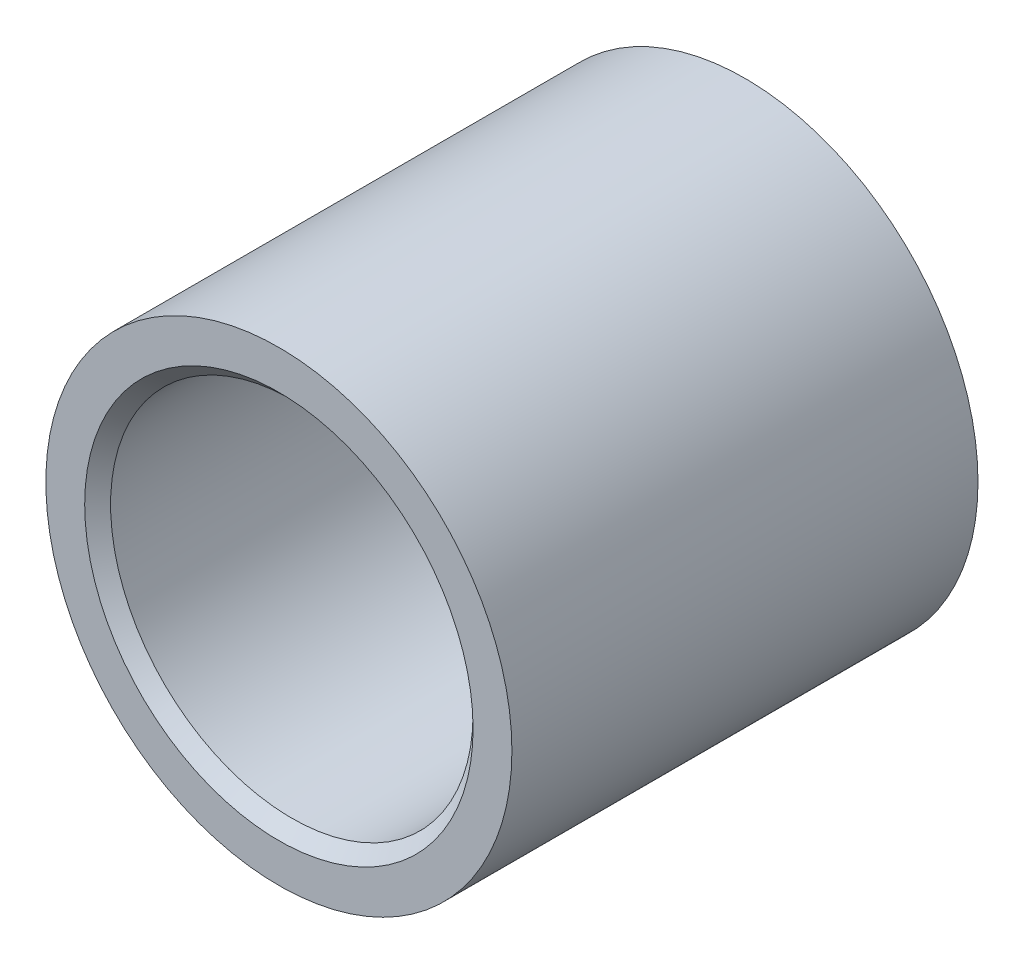
ISO-10303-21;
HEADER;
FILE_DESCRIPTION(('STEP AP214'),'2;1');
FILE_NAME('part.step','',(''),(''),'','','');
FILE_SCHEMA(('AUTOMOTIVE_DESIGN { 1 0 10303 214 1 1 1 1 }'));
ENDSEC;
DATA;
#1=APPLICATION_CONTEXT('core data for automotive mechanical design processes');
#2=APPLICATION_PROTOCOL_DEFINITION('international standard','automotive_design',2000,#1);
#3=PRODUCT_CONTEXT('',#1,'mechanical');
#4=PRODUCT('Part','Part','',(#3));
#5=PRODUCT_RELATED_PRODUCT_CATEGORY('part','',(#4));
#6=PRODUCT_DEFINITION_FORMATION('','',#4);
#7=PRODUCT_DEFINITION_CONTEXT('part definition',#1,'design');
#8=PRODUCT_DEFINITION('design','',#6,#7);
#9=PRODUCT_DEFINITION_SHAPE('','',#8);
#10=(LENGTH_UNIT() NAMED_UNIT(*) SI_UNIT(.MILLI.,.METRE.));
#11=(NAMED_UNIT(*) PLANE_ANGLE_UNIT() SI_UNIT($,.RADIAN.));
#12=(NAMED_UNIT(*) SI_UNIT($,.STERADIAN.) SOLID_ANGLE_UNIT());
#13=UNCERTAINTY_MEASURE_WITH_UNIT(LENGTH_MEASURE(1.E-05),#10,'distance_accuracy_value','');
#14=(GEOMETRIC_REPRESENTATION_CONTEXT(3) GLOBAL_UNCERTAINTY_ASSIGNED_CONTEXT((#13)) GLOBAL_UNIT_ASSIGNED_CONTEXT((#10,
#11,#12)) REPRESENTATION_CONTEXT('',''));
#15=CARTESIAN_POINT('',(0.,0.,0.));
#16=DIRECTION('',(0.,0.,1.));
#17=DIRECTION('',(1.,0.,0.));
#18=AXIS2_PLACEMENT_3D('',#15,#16,#17);
#19=CARTESIAN_POINT('',(0.,0.,18.));
#20=DIRECTION('',(0.,0.,1.));
#21=DIRECTION('',(1.,0.,0.));
#22=AXIS2_PLACEMENT_3D('',#19,#20,#21);
#23=PLANE('',#22);
#24=CARTESIAN_POINT('',(0.,0.,18.));
#25=DIRECTION('',(0.,0.,1.));
#26=DIRECTION('',(1.,0.,0.));
#27=AXIS2_PLACEMENT_3D('',#24,#25,#26);
#28=CIRCLE('',#27,15.);
#29=CARTESIAN_POINT('',(15.,0.,18.));
#30=VERTEX_POINT('',#29);
#31=EDGE_CURVE('E10',#30,#30,#28,.F.);
#32=ORIENTED_EDGE('',*,*,#31,.T.);
#33=EDGE_LOOP('',(#32));
#34=FACE_BOUND('',#33,.T.);
#35=CARTESIAN_POINT('',(0.,0.,18.));
#36=DIRECTION('',(0.,0.,1.));
#37=DIRECTION('',(1.,0.,0.));
#38=AXIS2_PLACEMENT_3D('',#35,#36,#37);
#39=CIRCLE('',#38,18.);
#40=CARTESIAN_POINT('',(18.,0.,18.));
#41=VERTEX_POINT('',#40);
#42=EDGE_CURVE('E66',#41,#41,#39,.T.);
#43=ORIENTED_EDGE('',*,*,#42,.T.);
#44=EDGE_LOOP('',(#43));
#45=FACE_BOUND('',#44,.T.);
#46=ADVANCED_FACE('F45',(#34,#45),#23,.T.);
#47=CARTESIAN_POINT('',(0.,0.,-18.));
#48=DIRECTION('',(0.,0.,1.));
#49=DIRECTION('',(1.,0.,0.));
#50=AXIS2_PLACEMENT_3D('',#47,#48,#49);
#51=PLANE('',#50);
#52=CARTESIAN_POINT('',(0.,0.,-18.));
#53=DIRECTION('',(0.,0.,1.));
#54=DIRECTION('',(1.,0.,0.));
#55=AXIS2_PLACEMENT_3D('',#52,#53,#54);
#56=CIRCLE('',#55,15.);
#57=CARTESIAN_POINT('',(15.,0.,-18.));
#58=VERTEX_POINT('',#57);
#59=EDGE_CURVE('E61',#58,#58,#56,.T.);
#60=ORIENTED_EDGE('',*,*,#59,.T.);
#61=EDGE_LOOP('',(#60));
#62=FACE_BOUND('',#61,.T.);
#63=CARTESIAN_POINT('',(0.,0.,-18.));
#64=DIRECTION('',(0.,0.,1.));
#65=DIRECTION('',(1.,0.,0.));
#66=AXIS2_PLACEMENT_3D('',#63,#64,#65);
#67=CIRCLE('',#66,18.);
#68=CARTESIAN_POINT('',(18.,0.,-18.));
#69=VERTEX_POINT('',#68);
#70=EDGE_CURVE('E67',#69,#69,#67,.T.);
#71=ORIENTED_EDGE('',*,*,#70,.F.);
#72=EDGE_LOOP('',(#71));
#73=FACE_BOUND('',#72,.T.);
#74=ADVANCED_FACE('F78',(#62,#73),#51,.F.);
#75=CARTESIAN_POINT('',(0.,0.,18.));
#76=DIRECTION('',(0.,0.,-1.));
#77=DIRECTION('',(-1.,0.,0.));
#78=AXIS2_PLACEMENT_3D('',#75,#76,#77);
#79=CYLINDRICAL_SURFACE('',#78,18.);
#80=ORIENTED_EDGE('',*,*,#42,.F.);
#81=EDGE_LOOP('',(#80));
#82=FACE_BOUND('',#81,.T.);
#83=ORIENTED_EDGE('',*,*,#70,.T.);
#84=EDGE_LOOP('',(#83));
#85=FACE_BOUND('',#84,.T.);
#86=ADVANCED_FACE('F74',(#82,#85),#79,.T.);
#87=CARTESIAN_POINT('',(0.,0.,18.));
#88=DIRECTION('',(0.,0.,-1.));
#89=DIRECTION('',(-1.,0.,0.));
#90=AXIS2_PLACEMENT_3D('',#87,#88,#89);
#91=CYLINDRICAL_SURFACE('',#90,14.);
#92=CARTESIAN_POINT('',(0.,0.,-17.));
#93=DIRECTION('',(0.,0.,1.));
#94=DIRECTION('',(1.,0.,0.));
#95=AXIS2_PLACEMENT_3D('',#92,#93,#94);
#96=CIRCLE('',#95,14.);
#97=CARTESIAN_POINT('',(14.,0.,-17.));
#98=VERTEX_POINT('',#97);
#99=EDGE_CURVE('E53',#98,#98,#96,.F.);
#100=ORIENTED_EDGE('',*,*,#99,.T.);
#101=EDGE_LOOP('',(#100));
#102=FACE_BOUND('',#101,.T.);
#103=CARTESIAN_POINT('',(0.,0.,17.));
#104=DIRECTION('',(0.,0.,1.));
#105=DIRECTION('',(1.,0.,0.));
#106=AXIS2_PLACEMENT_3D('',#103,#104,#105);
#107=CIRCLE('',#106,14.);
#108=CARTESIAN_POINT('',(14.,0.,17.));
#109=VERTEX_POINT('',#108);
#110=EDGE_CURVE('E57',#109,#109,#107,.T.);
#111=ORIENTED_EDGE('',*,*,#110,.T.);
#112=EDGE_LOOP('',(#111));
#113=FACE_BOUND('',#112,.T.);
#114=ADVANCED_FACE('F77',(#102,#113),#91,.F.);
#115=CARTESIAN_POINT('',(0.,0.,-18.));
#116=DIRECTION('',(0.,0.,-1.));
#117=DIRECTION('',(-1.,0.,0.));
#118=AXIS2_PLACEMENT_3D('',#115,#116,#117);
#119=CONICAL_SURFACE('',#118,15.,0.785398163397442);
#120=ORIENTED_EDGE('',*,*,#99,.F.);
#121=EDGE_LOOP('',(#120));
#122=FACE_BOUND('',#121,.T.);
#123=ORIENTED_EDGE('',*,*,#59,.F.);
#124=EDGE_LOOP('',(#123));
#125=FACE_BOUND('',#124,.T.);
#126=ADVANCED_FACE('F91',(#122,#125),#119,.F.);
#127=CARTESIAN_POINT('',(0.,0.,17.));
#128=DIRECTION('',(0.,0.,1.));
#129=DIRECTION('',(1.,0.,0.));
#130=AXIS2_PLACEMENT_3D('',#127,#128,#129);
#131=CONICAL_SURFACE('',#130,14.,0.785398163397451);
#132=ORIENTED_EDGE('',*,*,#31,.F.);
#133=EDGE_LOOP('',(#132));
#134=FACE_BOUND('',#133,.T.);
#135=ORIENTED_EDGE('',*,*,#110,.F.);
#136=EDGE_LOOP('',(#135));
#137=FACE_BOUND('',#136,.T.);
#138=ADVANCED_FACE('F48',(#134,#137),#131,.F.);
#139=CLOSED_SHELL('',(#46,#74,#86,#114,#126,#138));
#140=MANIFOLD_SOLID_BREP('B2',#139);
#141=ADVANCED_BREP_SHAPE_REPRESENTATION('',(#18,#140),#14);
#142=SHAPE_DEFINITION_REPRESENTATION(#9,#141);
ENDSEC;
END-ISO-10303-21;
